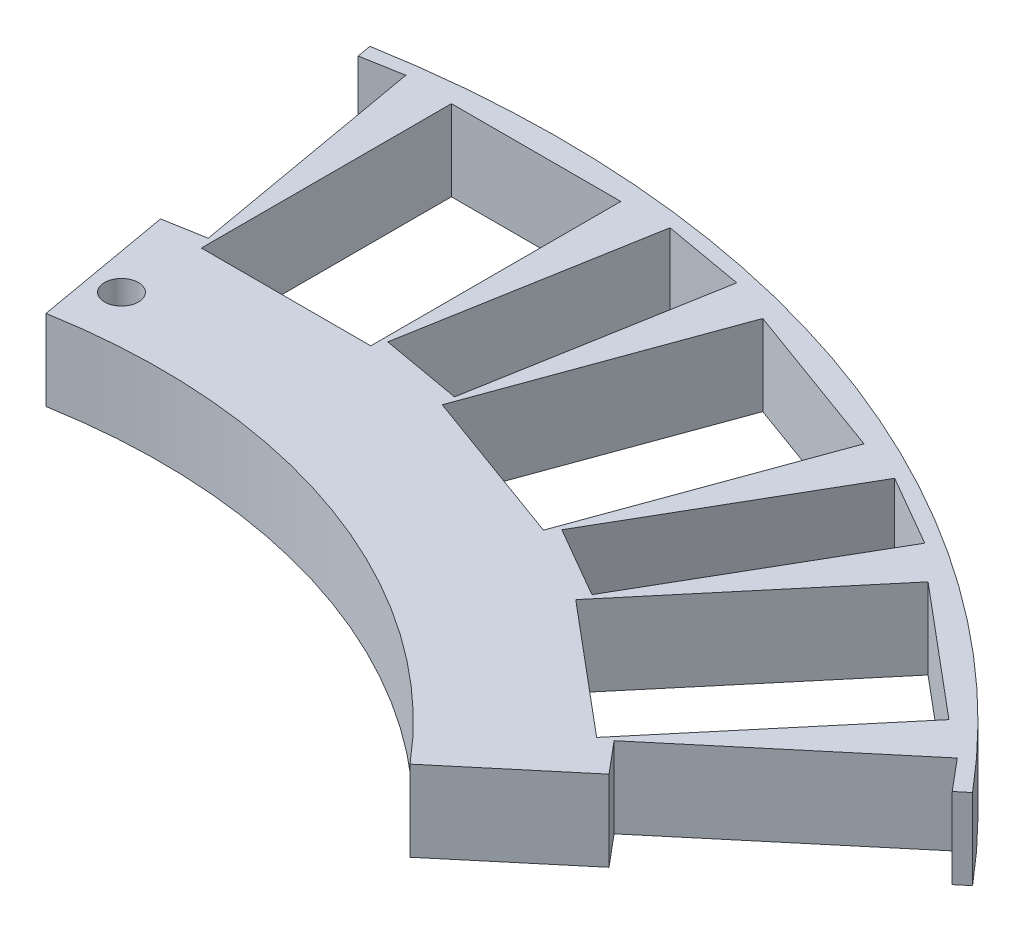
ISO-10303-21;
HEADER;
FILE_DESCRIPTION(('STEP AP214'),'2;1');
FILE_NAME('part.step','',(''),(''),'','','');
FILE_SCHEMA(('AUTOMOTIVE_DESIGN { 1 0 10303 214 1 1 1 1 }'));
ENDSEC;
DATA;
#1=APPLICATION_CONTEXT('core data for automotive mechanical design processes');
#2=APPLICATION_PROTOCOL_DEFINITION('international standard','automotive_design',2000,#1);
#3=PRODUCT_CONTEXT('',#1,'mechanical');
#4=PRODUCT('Part','Part','',(#3));
#5=PRODUCT_RELATED_PRODUCT_CATEGORY('part','',(#4));
#6=PRODUCT_DEFINITION_FORMATION('','',#4);
#7=PRODUCT_DEFINITION_CONTEXT('part definition',#1,'design');
#8=PRODUCT_DEFINITION('design','',#6,#7);
#9=PRODUCT_DEFINITION_SHAPE('','',#8);
#10=(LENGTH_UNIT() NAMED_UNIT(*) SI_UNIT(.MILLI.,.METRE.));
#11=(NAMED_UNIT(*) PLANE_ANGLE_UNIT() SI_UNIT($,.RADIAN.));
#12=(NAMED_UNIT(*) SI_UNIT($,.STERADIAN.) SOLID_ANGLE_UNIT());
#13=UNCERTAINTY_MEASURE_WITH_UNIT(LENGTH_MEASURE(1.E-05),#10,'distance_accuracy_value','');
#14=(GEOMETRIC_REPRESENTATION_CONTEXT(3) GLOBAL_UNCERTAINTY_ASSIGNED_CONTEXT((#13)) GLOBAL_UNIT_ASSIGNED_CONTEXT((#10,
#11,#12)) REPRESENTATION_CONTEXT('',''));
#15=CARTESIAN_POINT('',(0.,0.,0.));
#16=DIRECTION('',(0.,0.,1.));
#17=DIRECTION('',(1.,0.,0.));
#18=AXIS2_PLACEMENT_3D('',#15,#16,#17);
#19=CARTESIAN_POINT('',(0.,5.,0.));
#20=DIRECTION('',(0.,1.,0.));
#21=DIRECTION('',(0.,0.,1.));
#22=AXIS2_PLACEMENT_3D('',#19,#20,#21);
#23=PLANE('',#22);
#24=DIRECTION('',(-0.866025403784436,0.,-0.500000000000004));
#25=VECTOR('',#24,1.);
#26=CARTESIAN_POINT('',(57.1877759871549,5.,-109.252133581619));
#27=LINE('',#26,#25);
#28=CARTESIAN_POINT('',(66.0212351057561,5.,-104.152133581618));
#29=VERTEX_POINT('',#28);
#30=CARTESIAN_POINT('',(57.1877759871549,5.,-109.252133581619));
#31=VERTEX_POINT('',#30);
#32=EDGE_CURVE('E305',#29,#31,#27,.T.);
#33=ORIENTED_EDGE('',*,*,#32,.F.);
#34=DIRECTION('',(0.500000000000004,0.,-0.866025403784436));
#35=VECTOR('',#34,1.);
#36=CARTESIAN_POINT('',(50.921235105756,5.,-77.9981663873285));
#37=LINE('',#36,#35);
#38=CARTESIAN_POINT('',(50.921235105756,5.,-77.9981663873285));
#39=VERTEX_POINT('',#38);
#40=EDGE_CURVE('E303',#39,#29,#37,.T.);
#41=ORIENTED_EDGE('',*,*,#40,.F.);
#42=DIRECTION('',(0.866025403784436,0.,0.500000000000005));
#43=VECTOR('',#42,1.);
#44=CARTESIAN_POINT('',(42.0877759871548,5.,-83.0981663873286));
#45=LINE('',#44,#43);
#46=CARTESIAN_POINT('',(42.0877759871548,5.,-83.0981663873286));
#47=VERTEX_POINT('',#46);
#48=EDGE_CURVE('E311',#47,#39,#45,.T.);
#49=ORIENTED_EDGE('',*,*,#48,.F.);
#50=DIRECTION('',(-0.500000000000004,0.,0.866025403784436));
#51=VECTOR('',#50,1.);
#52=CARTESIAN_POINT('',(42.0877759871548,5.,-83.0981663873286));
#53=LINE('',#52,#51);
#54=EDGE_CURVE('E308',#31,#47,#53,.T.);
#55=ORIENTED_EDGE('',*,*,#54,.F.);
#56=EDGE_LOOP('',(#33,#41,#49,#55));
#57=FACE_BOUND('',#56,.T.);
#58=DIRECTION('',(-0.984807753012207,0.,-0.173648177666935));
#59=VECTOR('',#58,1.);
#60=CARTESIAN_POINT('',(16.3725007080666,5.,-122.222795071366));
#61=LINE('',#60,#59);
#62=CARTESIAN_POINT('',(26.4175397887911,5.,-120.451583659163));
#63=VERTEX_POINT('',#62);
#64=CARTESIAN_POINT('',(16.3725007080666,5.,-122.222795071366));
#65=VERTEX_POINT('',#64);
#66=EDGE_CURVE('E336',#63,#65,#61,.T.);
#67=ORIENTED_EDGE('',*,*,#66,.F.);
#68=DIRECTION('',(0.173648177666934,0.,-0.984807753012207));
#69=VECTOR('',#68,1.);
#70=CARTESIAN_POINT('',(21.1733648232497,5.,-90.7103895181948));
#71=LINE('',#70,#69);
#72=CARTESIAN_POINT('',(21.1733648232497,5.,-90.7103895181948));
#73=VERTEX_POINT('',#72);
#74=EDGE_CURVE('E334',#73,#63,#71,.T.);
#75=ORIENTED_EDGE('',*,*,#74,.F.);
#76=DIRECTION('',(0.984807753012207,0.,0.173648177666935));
#77=VECTOR('',#76,1.);
#78=CARTESIAN_POINT('',(11.1283257425252,5.,-92.4816009303976));
#79=LINE('',#78,#77);
#80=CARTESIAN_POINT('',(11.1283257425252,5.,-92.4816009303976));
#81=VERTEX_POINT('',#80);
#82=EDGE_CURVE('E342',#81,#73,#79,.T.);
#83=ORIENTED_EDGE('',*,*,#82,.F.);
#84=DIRECTION('',(-0.173648177666934,0.,0.984807753012207));
#85=VECTOR('',#84,1.);
#86=CARTESIAN_POINT('',(11.1283257425252,5.,-92.4816009303976));
#87=LINE('',#86,#85);
#88=EDGE_CURVE('E339',#65,#81,#87,.T.);
#89=ORIENTED_EDGE('',*,*,#88,.F.);
#90=EDGE_LOOP('',(#67,#75,#83,#89));
#91=FACE_BOUND('',#90,.T.);
#92=DIRECTION('',(0.642787609686539,0.,-0.766044443118978));
#93=VECTOR('',#92,1.);
#94=CARTESIAN_POINT('',(86.4635550345105,5.,-86.7081521588147));
#95=LINE('',#94,#93);
#96=CARTESIAN_POINT('',(66.5371391342278,5.,-62.9607744221263));
#97=VERTEX_POINT('',#96);
#98=CARTESIAN_POINT('',(86.4635550345105,5.,-86.7081521588147));
#99=VERTEX_POINT('',#98);
#100=EDGE_CURVE('E394',#97,#99,#95,.T.);
#101=ORIENTED_EDGE('',*,*,#100,.F.);
#102=DIRECTION('',(0.766044443118942,0.,0.642787609686582));
#103=VECTOR('',#102,1.);
#104=CARTESIAN_POINT('',(50.4502058287284,5.,-76.4593142255459));
#105=LINE('',#104,#103);
#106=CARTESIAN_POINT('',(50.4502058287284,5.,-76.4593142255459));
#107=VERTEX_POINT('',#106);
#108=EDGE_CURVE('E392',#107,#97,#105,.T.);
#109=ORIENTED_EDGE('',*,*,#108,.F.);
#110=DIRECTION('',(-0.642787609686539,0.,0.766044443118978));
#111=VECTOR('',#110,1.);
#112=CARTESIAN_POINT('',(70.3766217290111,5.,-100.206691962234));
#113=LINE('',#112,#111);
#114=CARTESIAN_POINT('',(70.3766217290111,5.,-100.206691962234));
#115=VERTEX_POINT('',#114);
#116=EDGE_CURVE('E400',#115,#107,#113,.T.);
#117=ORIENTED_EDGE('',*,*,#116,.F.);
#118=DIRECTION('',(-0.766044443118942,0.,-0.642787609686582));
#119=VECTOR('',#118,1.);
#120=CARTESIAN_POINT('',(70.3766217290111,5.,-100.206691962234));
#121=LINE('',#120,#119);
#122=EDGE_CURVE('E397',#99,#115,#121,.T.);
#123=ORIENTED_EDGE('',*,*,#122,.F.);
#124=EDGE_LOOP('',(#101,#109,#117,#123));
#125=FACE_BOUND('',#124,.T.);
#126=DIRECTION('',(0.342020143325691,0.,-0.939692620785901));
#127=VECTOR('',#126,1.);
#128=CARTESIAN_POINT('',(51.5932300039861,5.,-111.051288230968));
#129=LINE('',#128,#127);
#130=CARTESIAN_POINT('',(40.9906055608897,5.,-81.9208169866052));
#131=VERTEX_POINT('',#130);
#132=CARTESIAN_POINT('',(51.5932300039861,5.,-111.051288230968));
#133=VERTEX_POINT('',#132);
#134=EDGE_CURVE('E425',#131,#133,#129,.T.);
#135=ORIENTED_EDGE('',*,*,#134,.F.);
#136=DIRECTION('',(0.939692620785955,0.,0.342020143325541));
#137=VECTOR('',#136,1.);
#138=CARTESIAN_POINT('',(21.2570605243848,5.,-89.1032399964415));
#139=LINE('',#138,#137);
#140=CARTESIAN_POINT('',(21.2570605243848,5.,-89.1032399964415));
#141=VERTEX_POINT('',#140);
#142=EDGE_CURVE('E423',#141,#131,#139,.T.);
#143=ORIENTED_EDGE('',*,*,#142,.F.);
#144=DIRECTION('',(-0.342020143325669,0.,0.939692620785909));
#145=VECTOR('',#144,1.);
#146=CARTESIAN_POINT('',(31.8596849674805,5.,-118.233711240805));
#147=LINE('',#146,#145);
#148=CARTESIAN_POINT('',(31.8596849674805,5.,-118.233711240805));
#149=VERTEX_POINT('',#148);
#150=EDGE_CURVE('E431',#149,#141,#147,.T.);
#151=ORIENTED_EDGE('',*,*,#150,.F.);
#152=DIRECTION('',(-0.939692620785955,0.,-0.342020143325541));
#153=VECTOR('',#152,1.);
#154=CARTESIAN_POINT('',(31.8596849674805,5.,-118.233711240805));
#155=LINE('',#154,#153);
#156=EDGE_CURVE('E428',#133,#149,#155,.T.);
#157=ORIENTED_EDGE('',*,*,#156,.F.);
#158=EDGE_LOOP('',(#135,#143,#151,#157));
#159=FACE_BOUND('',#158,.T.);
#160=DIRECTION('',(-1.,0.,0.));
#161=VECTOR('',#160,1.);
#162=CARTESIAN_POINT('',(-10.5,5.,-122.));
#163=LINE('',#162,#161);
#164=CARTESIAN_POINT('',(10.5,5.,-122.));
#165=VERTEX_POINT('',#164);
#166=CARTESIAN_POINT('',(-10.5,5.,-122.));
#167=VERTEX_POINT('',#166);
#168=EDGE_CURVE('E456',#165,#167,#163,.T.);
#169=ORIENTED_EDGE('',*,*,#168,.F.);
#170=DIRECTION('',(0.,0.,-1.));
#171=VECTOR('',#170,1.);
#172=CARTESIAN_POINT('',(10.5,5.,-122.));
#173=LINE('',#172,#171);
#174=CARTESIAN_POINT('',(10.5,5.,-91.));
#175=VERTEX_POINT('',#174);
#176=EDGE_CURVE('E454',#175,#165,#173,.T.);
#177=ORIENTED_EDGE('',*,*,#176,.F.);
#178=DIRECTION('',(1.,0.,0.));
#179=VECTOR('',#178,1.);
#180=CARTESIAN_POINT('',(-10.5,5.,-91.));
#181=LINE('',#180,#179);
#182=CARTESIAN_POINT('',(-10.5,5.,-91.));
#183=VERTEX_POINT('',#182);
#184=EDGE_CURVE('E462',#183,#175,#181,.T.);
#185=ORIENTED_EDGE('',*,*,#184,.F.);
#186=DIRECTION('',(0.,0.,1.));
#187=VECTOR('',#186,1.);
#188=CARTESIAN_POINT('',(-10.5,5.,-122.));
#189=LINE('',#188,#187);
#190=EDGE_CURVE('E459',#167,#183,#189,.T.);
#191=ORIENTED_EDGE('',*,*,#190,.F.);
#192=EDGE_LOOP('',(#169,#177,#185,#191));
#193=FACE_BOUND('',#192,.T.);
#194=CARTESIAN_POINT('',(-10.7031477620443,5.,-81.2984786326524));
#195=DIRECTION('',(0.,1.,0.));
#196=DIRECTION('',(0.,0.,1.));
#197=AXIS2_PLACEMENT_3D('',#194,#195,#196);
#198=CIRCLE('',#197,2.1);
#199=CARTESIAN_POINT('',(-10.7031477620443,5.,-79.1984786326525));
#200=VERTEX_POINT('',#199);
#201=EDGE_CURVE('E386',#200,#200,#198,.T.);
#202=ORIENTED_EDGE('',*,*,#201,.F.);
#203=EDGE_LOOP('',(#202));
#204=FACE_BOUND('',#203,.T.);
#205=CARTESIAN_POINT('',(0.,5.,0.));
#206=DIRECTION('',(0.,1.,0.));
#207=DIRECTION('',(0.,0.,1.));
#208=AXIS2_PLACEMENT_3D('',#205,#206,#207);
#209=CIRCLE('',#208,75.5);
#210=CARTESIAN_POINT('',(57.8363554554831,5.,-48.5304645313334));
#211=VERTEX_POINT('',#210);
#212=CARTESIAN_POINT('',(-13.110437413853,5.,-74.3529853524217));
#213=VERTEX_POINT('',#212);
#214=EDGE_CURVE('E259',#211,#213,#209,.T.);
#215=ORIENTED_EDGE('',*,*,#214,.F.);
#216=DIRECTION('',(0.766044443118981,0.,-0.642787609686535));
#217=VECTOR('',#216,1.);
#218=CARTESIAN_POINT('',(94.3835782899086,5.,-79.1972257322535));
#219=LINE('',#218,#217);
#220=CARTESIAN_POINT('',(71.2490361077154,5.,-59.7850399197201));
#221=VERTEX_POINT('',#220);
#222=EDGE_CURVE('E241',#211,#221,#219,.T.);
#223=ORIENTED_EDGE('',*,*,#222,.T.);
#224=DIRECTION('',(0.642787609686535,0.,0.766044443118981));
#225=VECTOR('',#224,1.);
#226=CARTESIAN_POINT('',(67.9708192983141,5.,-63.6918665796269));
#227=LINE('',#226,#225);
#228=CARTESIAN_POINT('',(67.9708192983141,5.,-63.6918665796269));
#229=VERTEX_POINT('',#228);
#230=EDGE_CURVE('E283',#229,#221,#227,.T.);
#231=ORIENTED_EDGE('',*,*,#230,.F.);
#232=DIRECTION('',(-0.766044443118981,0.,0.642787609686536));
#233=VECTOR('',#232,1.);
#234=CARTESIAN_POINT('',(67.9708192983141,5.,-63.6918665796269));
#235=LINE('',#234,#233);
#236=CARTESIAN_POINT('',(91.1053614805073,5.,-83.1040523921603));
#237=VERTEX_POINT('',#236);
#238=EDGE_CURVE('E291',#237,#229,#235,.T.);
#239=ORIENTED_EDGE('',*,*,#238,.F.);
#240=DIRECTION('',(-0.642787609686535,0.,-0.766044443118981));
#241=VECTOR('',#240,1.);
#242=CARTESIAN_POINT('',(91.1053614805073,5.,-83.1040523921603));
#243=LINE('',#242,#241);
#244=CARTESIAN_POINT('',(94.3835782899086,5.,-79.1972257322535));
#245=VERTEX_POINT('',#244);
#246=EDGE_CURVE('E289',#245,#237,#243,.T.);
#247=ORIENTED_EDGE('',*,*,#246,.F.);
#248=CARTESIAN_POINT('',(95.7555553898727,5.,-80.3484512108169));
#249=VERTEX_POINT('',#248);
#250=EDGE_CURVE('E252',#245,#249,#219,.T.);
#251=ORIENTED_EDGE('',*,*,#250,.T.);
#252=CARTESIAN_POINT('',(0.,5.,0.));
#253=DIRECTION('',(0.,1.,0.));
#254=DIRECTION('',(0.,0.,1.));
#255=AXIS2_PLACEMENT_3D('',#252,#253,#254);
#256=CIRCLE('',#255,125.);
#257=CARTESIAN_POINT('',(-21.7060222083659,5.,-123.100969126526));
#258=VERTEX_POINT('',#257);
#259=EDGE_CURVE('E269',#249,#258,#256,.T.);
#260=ORIENTED_EDGE('',*,*,#259,.T.);
#261=DIRECTION('',(0.173648177666928,0.,0.984807753012209));
#262=VECTOR('',#261,1.);
#263=CARTESIAN_POINT('',(-10.697510124214,5.,-60.6685946826325));
#264=LINE('',#263,#262);
#265=CARTESIAN_POINT('',(-21.3950202484281,5.,-121.337189365265));
#266=VERTEX_POINT('',#265);
#267=EDGE_CURVE('E866',#258,#266,#264,.T.);
#268=ORIENTED_EDGE('',*,*,#267,.T.);
#269=DIRECTION('',(-0.984807753012209,0.,0.173648177666927));
#270=VECTOR('',#269,1.);
#271=CARTESIAN_POINT('',(-26.4175397887903,5.,-120.451583659164));
#272=LINE('',#271,#270);
#273=CARTESIAN_POINT('',(-16.3725007080658,5.,-122.222795071366));
#274=VERTEX_POINT('',#273);
#275=EDGE_CURVE('E367',#274,#266,#272,.T.);
#276=ORIENTED_EDGE('',*,*,#275,.F.);
#277=DIRECTION('',(-0.173648177666927,0.,-0.984807753012209));
#278=VECTOR('',#277,1.);
#279=CARTESIAN_POINT('',(-11.1283257425246,5.,-92.4816009303976));
#280=LINE('',#279,#278);
#281=CARTESIAN_POINT('',(-11.1283257425246,5.,-92.4816009303976));
#282=VERTEX_POINT('',#281);
#283=EDGE_CURVE('E365',#282,#274,#280,.T.);
#284=ORIENTED_EDGE('',*,*,#283,.F.);
#285=DIRECTION('',(0.984807753012209,0.,-0.173648177666927));
#286=VECTOR('',#285,1.);
#287=CARTESIAN_POINT('',(-21.1733648232491,5.,-90.710389518195));
#288=LINE('',#287,#286);
#289=CARTESIAN_POINT('',(-16.1508452828869,5.,-91.5959952242963));
#290=VERTEX_POINT('',#289);
#291=EDGE_CURVE('E371',#290,#282,#288,.T.);
#292=ORIENTED_EDGE('',*,*,#291,.F.);
#293=EDGE_CURVE('E57',#290,#213,#264,.T.);
#294=ORIENTED_EDGE('',*,*,#293,.T.);
#295=EDGE_LOOP('',(#215,#223,#231,#239,#247,#251,#260,#268,#276,#284,#292,#294));
#296=FACE_BOUND('',#295,.T.);
#297=ADVANCED_FACE('F34',(#57,#91,#125,#159,#193,#204,#296),#23,.T.);
#298=CARTESIAN_POINT('',(0.,-5.,0.));
#299=DIRECTION('',(0.,1.,0.));
#300=DIRECTION('',(0.,0.,1.));
#301=AXIS2_PLACEMENT_3D('',#298,#299,#300);
#302=PLANE('',#301);
#303=DIRECTION('',(0.173648177666934,0.,-0.984807753012207));
#304=VECTOR('',#303,1.);
#305=CARTESIAN_POINT('',(21.1733648232497,-5.,-90.7103895181948));
#306=LINE('',#305,#304);
#307=CARTESIAN_POINT('',(21.1733648232497,-5.,-90.7103895181948));
#308=VERTEX_POINT('',#307);
#309=CARTESIAN_POINT('',(26.4175397887911,-5.,-120.451583659163));
#310=VERTEX_POINT('',#309);
#311=EDGE_CURVE('E333',#308,#310,#306,.T.);
#312=ORIENTED_EDGE('',*,*,#311,.T.);
#313=DIRECTION('',(-0.984807753012207,0.,-0.173648177666935));
#314=VECTOR('',#313,1.);
#315=CARTESIAN_POINT('',(16.3725007080666,-5.,-122.222795071366));
#316=LINE('',#315,#314);
#317=CARTESIAN_POINT('',(16.3725007080666,-5.,-122.222795071366));
#318=VERTEX_POINT('',#317);
#319=EDGE_CURVE('E347',#310,#318,#316,.T.);
#320=ORIENTED_EDGE('',*,*,#319,.T.);
#321=DIRECTION('',(-0.173648177666934,0.,0.984807753012207));
#322=VECTOR('',#321,1.);
#323=CARTESIAN_POINT('',(11.1283257425252,-5.,-92.4816009303976));
#324=LINE('',#323,#322);
#325=CARTESIAN_POINT('',(11.1283257425252,-5.,-92.4816009303976));
#326=VERTEX_POINT('',#325);
#327=EDGE_CURVE('E350',#318,#326,#324,.T.);
#328=ORIENTED_EDGE('',*,*,#327,.T.);
#329=DIRECTION('',(0.984807753012207,0.,0.173648177666935));
#330=VECTOR('',#329,1.);
#331=CARTESIAN_POINT('',(11.1283257425252,-5.,-92.4816009303976));
#332=LINE('',#331,#330);
#333=EDGE_CURVE('E337',#326,#308,#332,.T.);
#334=ORIENTED_EDGE('',*,*,#333,.T.);
#335=EDGE_LOOP('',(#312,#320,#328,#334));
#336=FACE_BOUND('',#335,.T.);
#337=CARTESIAN_POINT('',(-10.7031477620443,-5.,-81.2984786326524));
#338=DIRECTION('',(0.,1.,0.));
#339=DIRECTION('',(0.,0.,1.));
#340=AXIS2_PLACEMENT_3D('',#337,#338,#339);
#341=CIRCLE('',#340,2.1);
#342=CARTESIAN_POINT('',(-10.7031477620443,-5.,-79.1984786326525));
#343=VERTEX_POINT('',#342);
#344=EDGE_CURVE('E385',#343,#343,#341,.T.);
#345=ORIENTED_EDGE('',*,*,#344,.T.);
#346=EDGE_LOOP('',(#345));
#347=FACE_BOUND('',#346,.T.);
#348=DIRECTION('',(0.939692620785955,0.,0.342020143325541));
#349=VECTOR('',#348,1.);
#350=CARTESIAN_POINT('',(21.2570605243848,-5.,-89.1032399964415));
#351=LINE('',#350,#349);
#352=CARTESIAN_POINT('',(21.2570605243848,-5.,-89.1032399964415));
#353=VERTEX_POINT('',#352);
#354=CARTESIAN_POINT('',(40.9906055608897,-5.,-81.9208169866052));
#355=VERTEX_POINT('',#354);
#356=EDGE_CURVE('E422',#353,#355,#351,.T.);
#357=ORIENTED_EDGE('',*,*,#356,.T.);
#358=DIRECTION('',(0.342020143325691,0.,-0.939692620785901));
#359=VECTOR('',#358,1.);
#360=CARTESIAN_POINT('',(51.5932300039861,-5.,-111.051288230968));
#361=LINE('',#360,#359);
#362=CARTESIAN_POINT('',(51.5932300039861,-5.,-111.051288230968));
#363=VERTEX_POINT('',#362);
#364=EDGE_CURVE('E436',#355,#363,#361,.T.);
#365=ORIENTED_EDGE('',*,*,#364,.T.);
#366=DIRECTION('',(-0.939692620785955,0.,-0.342020143325541));
#367=VECTOR('',#366,1.);
#368=CARTESIAN_POINT('',(31.8596849674805,-5.,-118.233711240805));
#369=LINE('',#368,#367);
#370=CARTESIAN_POINT('',(31.8596849674805,-5.,-118.233711240805));
#371=VERTEX_POINT('',#370);
#372=EDGE_CURVE('E439',#363,#371,#369,.T.);
#373=ORIENTED_EDGE('',*,*,#372,.T.);
#374=DIRECTION('',(-0.342020143325669,0.,0.939692620785909));
#375=VECTOR('',#374,1.);
#376=CARTESIAN_POINT('',(31.8596849674805,-5.,-118.233711240805));
#377=LINE('',#376,#375);
#378=EDGE_CURVE('E426',#371,#353,#377,.T.);
#379=ORIENTED_EDGE('',*,*,#378,.T.);
#380=EDGE_LOOP('',(#357,#365,#373,#379));
#381=FACE_BOUND('',#380,.T.);
#382=DIRECTION('',(0.,0.,-1.));
#383=VECTOR('',#382,1.);
#384=CARTESIAN_POINT('',(10.5,-5.,-122.));
#385=LINE('',#384,#383);
#386=CARTESIAN_POINT('',(10.5,-5.,-91.));
#387=VERTEX_POINT('',#386);
#388=CARTESIAN_POINT('',(10.5,-5.,-122.));
#389=VERTEX_POINT('',#388);
#390=EDGE_CURVE('E453',#387,#389,#385,.T.);
#391=ORIENTED_EDGE('',*,*,#390,.T.);
#392=DIRECTION('',(-1.,0.,0.));
#393=VECTOR('',#392,1.);
#394=CARTESIAN_POINT('',(-10.5,-5.,-122.));
#395=LINE('',#394,#393);
#396=CARTESIAN_POINT('',(-10.5,-5.,-122.));
#397=VERTEX_POINT('',#396);
#398=EDGE_CURVE('E467',#389,#397,#395,.T.);
#399=ORIENTED_EDGE('',*,*,#398,.T.);
#400=DIRECTION('',(0.,0.,1.));
#401=VECTOR('',#400,1.);
#402=CARTESIAN_POINT('',(-10.5,-5.,-122.));
#403=LINE('',#402,#401);
#404=CARTESIAN_POINT('',(-10.5,-5.,-91.));
#405=VERTEX_POINT('',#404);
#406=EDGE_CURVE('E470',#397,#405,#403,.T.);
#407=ORIENTED_EDGE('',*,*,#406,.T.);
#408=DIRECTION('',(1.,0.,0.));
#409=VECTOR('',#408,1.);
#410=CARTESIAN_POINT('',(-10.5,-5.,-91.));
#411=LINE('',#410,#409);
#412=EDGE_CURVE('E457',#405,#387,#411,.T.);
#413=ORIENTED_EDGE('',*,*,#412,.T.);
#414=EDGE_LOOP('',(#391,#399,#407,#413));
#415=FACE_BOUND('',#414,.T.);
#416=DIRECTION('',(0.766044443118942,0.,0.642787609686582));
#417=VECTOR('',#416,1.);
#418=CARTESIAN_POINT('',(50.4502058287284,-5.,-76.4593142255459));
#419=LINE('',#418,#417);
#420=CARTESIAN_POINT('',(50.4502058287284,-5.,-76.4593142255459));
#421=VERTEX_POINT('',#420);
#422=CARTESIAN_POINT('',(66.5371391342278,-5.,-62.9607744221263));
#423=VERTEX_POINT('',#422);
#424=EDGE_CURVE('E389',#421,#423,#419,.T.);
#425=ORIENTED_EDGE('',*,*,#424,.T.);
#426=DIRECTION('',(0.642787609686539,0.,-0.766044443118978));
#427=VECTOR('',#426,1.);
#428=CARTESIAN_POINT('',(86.4635550345105,-5.,-86.7081521588147));
#429=LINE('',#428,#427);
#430=CARTESIAN_POINT('',(86.4635550345105,-5.,-86.7081521588147));
#431=VERTEX_POINT('',#430);
#432=EDGE_CURVE('E405',#423,#431,#429,.T.);
#433=ORIENTED_EDGE('',*,*,#432,.T.);
#434=DIRECTION('',(-0.766044443118942,0.,-0.642787609686582));
#435=VECTOR('',#434,1.);
#436=CARTESIAN_POINT('',(70.3766217290111,-5.,-100.206691962234));
#437=LINE('',#436,#435);
#438=CARTESIAN_POINT('',(70.3766217290111,-5.,-100.206691962234));
#439=VERTEX_POINT('',#438);
#440=EDGE_CURVE('E408',#431,#439,#437,.T.);
#441=ORIENTED_EDGE('',*,*,#440,.T.);
#442=DIRECTION('',(-0.642787609686539,0.,0.766044443118978));
#443=VECTOR('',#442,1.);
#444=CARTESIAN_POINT('',(70.3766217290111,-5.,-100.206691962234));
#445=LINE('',#444,#443);
#446=EDGE_CURVE('E395',#439,#421,#445,.T.);
#447=ORIENTED_EDGE('',*,*,#446,.T.);
#448=EDGE_LOOP('',(#425,#433,#441,#447));
#449=FACE_BOUND('',#448,.T.);
#450=DIRECTION('',(0.500000000000004,0.,-0.866025403784436));
#451=VECTOR('',#450,1.);
#452=CARTESIAN_POINT('',(50.921235105756,-5.,-77.9981663873285));
#453=LINE('',#452,#451);
#454=CARTESIAN_POINT('',(50.921235105756,-5.,-77.9981663873285));
#455=VERTEX_POINT('',#454);
#456=CARTESIAN_POINT('',(66.0212351057561,-5.,-104.152133581618));
#457=VERTEX_POINT('',#456);
#458=EDGE_CURVE('E302',#455,#457,#453,.T.);
#459=ORIENTED_EDGE('',*,*,#458,.T.);
#460=DIRECTION('',(-0.866025403784436,0.,-0.500000000000004));
#461=VECTOR('',#460,1.);
#462=CARTESIAN_POINT('',(57.1877759871549,-5.,-109.252133581619));
#463=LINE('',#462,#461);
#464=CARTESIAN_POINT('',(57.1877759871549,-5.,-109.252133581619));
#465=VERTEX_POINT('',#464);
#466=EDGE_CURVE('E316',#457,#465,#463,.T.);
#467=ORIENTED_EDGE('',*,*,#466,.T.);
#468=DIRECTION('',(-0.500000000000004,0.,0.866025403784436));
#469=VECTOR('',#468,1.);
#470=CARTESIAN_POINT('',(42.0877759871548,-5.,-83.0981663873286));
#471=LINE('',#470,#469);
#472=CARTESIAN_POINT('',(42.0877759871548,-5.,-83.0981663873286));
#473=VERTEX_POINT('',#472);
#474=EDGE_CURVE('E319',#465,#473,#471,.T.);
#475=ORIENTED_EDGE('',*,*,#474,.T.);
#476=DIRECTION('',(0.866025403784436,0.,0.500000000000005));
#477=VECTOR('',#476,1.);
#478=CARTESIAN_POINT('',(42.0877759871548,-5.,-83.0981663873286));
#479=LINE('',#478,#477);
#480=EDGE_CURVE('E306',#473,#455,#479,.T.);
#481=ORIENTED_EDGE('',*,*,#480,.T.);
#482=EDGE_LOOP('',(#459,#467,#475,#481));
#483=FACE_BOUND('',#482,.T.);
#484=DIRECTION('',(0.766044443118981,0.,-0.642787609686536));
#485=VECTOR('',#484,1.);
#486=CARTESIAN_POINT('',(51.3077536205209,-5.,-43.0523171395134));
#487=LINE('',#486,#485);
#488=CARTESIAN_POINT('',(57.8363554554831,-5.,-48.5304645313334));
#489=VERTEX_POINT('',#488);
#490=CARTESIAN_POINT('',(71.2490361077154,-5.,-59.7850399197201));
#491=VERTEX_POINT('',#490);
#492=EDGE_CURVE('E286',#489,#491,#487,.T.);
#493=ORIENTED_EDGE('',*,*,#492,.F.);
#494=CARTESIAN_POINT('',(0.,-5.,0.));
#495=DIRECTION('',(0.,1.,0.));
#496=DIRECTION('',(0.,0.,1.));
#497=AXIS2_PLACEMENT_3D('',#494,#495,#496);
#498=CIRCLE('',#497,75.5);
#499=CARTESIAN_POINT('',(-13.110437413853,-5.,-74.3529853524217));
#500=VERTEX_POINT('',#499);
#501=EDGE_CURVE('E261',#489,#500,#498,.T.);
#502=ORIENTED_EDGE('',*,*,#501,.T.);
#503=DIRECTION('',(0.173648177666927,0.,0.984807753012209));
#504=VECTOR('',#503,1.);
#505=CARTESIAN_POINT('',(-21.3950202484281,-5.,-121.337189365265));
#506=LINE('',#505,#504);
#507=CARTESIAN_POINT('',(-16.1508452828869,-5.,-91.5959952242963));
#508=VERTEX_POINT('',#507);
#509=EDGE_CURVE('E251',#508,#500,#506,.T.);
#510=ORIENTED_EDGE('',*,*,#509,.F.);
#511=DIRECTION('',(0.984807753012209,0.,-0.173648177666927));
#512=VECTOR('',#511,1.);
#513=CARTESIAN_POINT('',(-21.1733648232491,-5.,-90.710389518195));
#514=LINE('',#513,#512);
#515=CARTESIAN_POINT('',(-11.1283257425246,-5.,-92.4816009303976));
#516=VERTEX_POINT('',#515);
#517=EDGE_CURVE('E368',#508,#516,#514,.T.);
#518=ORIENTED_EDGE('',*,*,#517,.T.);
#519=DIRECTION('',(-0.173648177666927,0.,-0.984807753012209));
#520=VECTOR('',#519,1.);
#521=CARTESIAN_POINT('',(-11.1283257425246,-5.,-92.4816009303976));
#522=LINE('',#521,#520);
#523=CARTESIAN_POINT('',(-16.3725007080658,-5.,-122.222795071366));
#524=VERTEX_POINT('',#523);
#525=EDGE_CURVE('E364',#516,#524,#522,.T.);
#526=ORIENTED_EDGE('',*,*,#525,.T.);
#527=DIRECTION('',(-0.984807753012209,0.,0.173648177666927));
#528=VECTOR('',#527,1.);
#529=CARTESIAN_POINT('',(-26.4175397887903,-5.,-120.451583659164));
#530=LINE('',#529,#528);
#531=CARTESIAN_POINT('',(-21.3950202484281,-5.,-121.337189365265));
#532=VERTEX_POINT('',#531);
#533=EDGE_CURVE('E376',#524,#532,#530,.T.);
#534=ORIENTED_EDGE('',*,*,#533,.T.);
#535=CARTESIAN_POINT('',(-21.7060222083659,-5.,-123.100969126526));
#536=VERTEX_POINT('',#535);
#537=EDGE_CURVE('E49',#536,#532,#506,.T.);
#538=ORIENTED_EDGE('',*,*,#537,.F.);
#539=CARTESIAN_POINT('',(0.,-5.,0.));
#540=DIRECTION('',(0.,1.,0.));
#541=DIRECTION('',(0.,0.,1.));
#542=AXIS2_PLACEMENT_3D('',#539,#540,#541);
#543=CIRCLE('',#542,125.);
#544=CARTESIAN_POINT('',(95.7555553898727,-5.,-80.348451210817));
#545=VERTEX_POINT('',#544);
#546=EDGE_CURVE('E266',#545,#536,#543,.T.);
#547=ORIENTED_EDGE('',*,*,#546,.F.);
#548=CARTESIAN_POINT('',(94.3835782899086,-5.,-79.1972257322535));
#549=VERTEX_POINT('',#548);
#550=EDGE_CURVE('E861',#549,#545,#487,.T.);
#551=ORIENTED_EDGE('',*,*,#550,.F.);
#552=DIRECTION('',(-0.642787609686535,0.,-0.766044443118981));
#553=VECTOR('',#552,1.);
#554=CARTESIAN_POINT('',(91.1053614805073,-5.,-83.1040523921603));
#555=LINE('',#554,#553);
#556=CARTESIAN_POINT('',(91.1053614805073,-5.,-83.1040523921603));
#557=VERTEX_POINT('',#556);
#558=EDGE_CURVE('E293',#549,#557,#555,.T.);
#559=ORIENTED_EDGE('',*,*,#558,.T.);
#560=DIRECTION('',(-0.766044443118981,0.,0.642787609686536));
#561=VECTOR('',#560,1.);
#562=CARTESIAN_POINT('',(67.9708192983141,-5.,-63.6918665796269));
#563=LINE('',#562,#561);
#564=CARTESIAN_POINT('',(67.9708192983141,-5.,-63.6918665796269));
#565=VERTEX_POINT('',#564);
#566=EDGE_CURVE('E288',#557,#565,#563,.T.);
#567=ORIENTED_EDGE('',*,*,#566,.T.);
#568=DIRECTION('',(0.642787609686535,0.,0.766044443118981));
#569=VECTOR('',#568,1.);
#570=CARTESIAN_POINT('',(67.9708192983141,-5.,-63.6918665796269));
#571=LINE('',#570,#569);
#572=EDGE_CURVE('E281',#565,#491,#571,.T.);
#573=ORIENTED_EDGE('',*,*,#572,.T.);
#574=EDGE_LOOP('',(#493,#502,#510,#518,#526,#534,#538,#547,#551,#559,#567,#573));
#575=FACE_BOUND('',#574,.T.);
#576=ADVANCED_FACE('F285',(#336,#347,#381,#415,#449,#483,#575),#302,.F.);
#577=CARTESIAN_POINT('',(0.,5.,0.));
#578=DIRECTION('',(0.,-1.,0.));
#579=DIRECTION('',(0.,0.,-1.));
#580=AXIS2_PLACEMENT_3D('',#577,#578,#579);
#581=CYLINDRICAL_SURFACE('',#580,125.);
#582=DIRECTION('',(0.,-1.,0.));
#583=VECTOR('',#582,1.);
#584=CARTESIAN_POINT('',(95.7555553898727,5.,-80.3484512108169));
#585=LINE('',#584,#583);
#586=EDGE_CURVE('E262',#545,#249,#585,.F.);
#587=ORIENTED_EDGE('',*,*,#586,.F.);
#588=ORIENTED_EDGE('',*,*,#546,.T.);
#589=DIRECTION('',(0.,-1.,0.));
#590=VECTOR('',#589,1.);
#591=CARTESIAN_POINT('',(-21.7060222083659,5.,-123.100969126526));
#592=LINE('',#591,#590);
#593=EDGE_CURVE('E873',#258,#536,#592,.T.);
#594=ORIENTED_EDGE('',*,*,#593,.F.);
#595=ORIENTED_EDGE('',*,*,#259,.F.);
#596=EDGE_LOOP('',(#587,#588,#594,#595));
#597=FACE_BOUND('',#596,.T.);
#598=ADVANCED_FACE('F36',(#597),#581,.T.);
#599=CARTESIAN_POINT('',(0.,5.,0.));
#600=DIRECTION('',(0.,-1.,0.));
#601=DIRECTION('',(0.,0.,-1.));
#602=AXIS2_PLACEMENT_3D('',#599,#600,#601);
#603=CYLINDRICAL_SURFACE('',#602,75.5);
#604=ORIENTED_EDGE('',*,*,#501,.F.);
#605=DIRECTION('',(0.,-1.,0.));
#606=VECTOR('',#605,1.);
#607=CARTESIAN_POINT('',(57.8363554554831,5.,-48.5304645313334));
#608=LINE('',#607,#606);
#609=EDGE_CURVE('E244',#489,#211,#608,.F.);
#610=ORIENTED_EDGE('',*,*,#609,.T.);
#611=ORIENTED_EDGE('',*,*,#214,.T.);
#612=DIRECTION('',(0.,-1.,0.));
#613=VECTOR('',#612,1.);
#614=CARTESIAN_POINT('',(-13.110437413853,5.,-74.3529853524217));
#615=LINE('',#614,#613);
#616=EDGE_CURVE('E871',#213,#500,#615,.T.);
#617=ORIENTED_EDGE('',*,*,#616,.T.);
#618=EDGE_LOOP('',(#604,#610,#611,#617));
#619=FACE_BOUND('',#618,.T.);
#620=ADVANCED_FACE('F257',(#619),#603,.F.);
#621=CARTESIAN_POINT('',(-26.4175397887903,5.,-120.451583659164));
#622=DIRECTION('',(0.173648177666927,0.,0.984807753012209));
#623=DIRECTION('',(0.984807753012209,0.,-0.173648177666927));
#624=AXIS2_PLACEMENT_3D('',#621,#622,#623);
#625=PLANE('',#624);
#626=ORIENTED_EDGE('',*,*,#275,.T.);
#627=DIRECTION('',(0.,-1.,0.));
#628=VECTOR('',#627,1.);
#629=CARTESIAN_POINT('',(-21.3950202484281,5.,-121.337189365265));
#630=LINE('',#629,#628);
#631=EDGE_CURVE('E858',#266,#532,#630,.T.);
#632=ORIENTED_EDGE('',*,*,#631,.T.);
#633=ORIENTED_EDGE('',*,*,#533,.F.);
#634=DIRECTION('',(0.,-1.,0.));
#635=VECTOR('',#634,1.);
#636=CARTESIAN_POINT('',(-16.3725007080658,5.,-122.222795071366));
#637=LINE('',#636,#635);
#638=EDGE_CURVE('E382',#274,#524,#637,.T.);
#639=ORIENTED_EDGE('',*,*,#638,.F.);
#640=EDGE_LOOP('',(#626,#632,#633,#639));
#641=FACE_BOUND('',#640,.T.);
#642=ADVANCED_FACE('F522',(#641),#625,.T.);
#643=CARTESIAN_POINT('',(-21.1733648232491,5.,-90.710389518195));
#644=DIRECTION('',(-0.173648177666927,0.,-0.984807753012209));
#645=DIRECTION('',(-0.984807753012209,0.,0.173648177666927));
#646=AXIS2_PLACEMENT_3D('',#643,#644,#645);
#647=PLANE('',#646);
#648=ORIENTED_EDGE('',*,*,#517,.F.);
#649=DIRECTION('',(0.,1.,0.));
#650=VECTOR('',#649,1.);
#651=CARTESIAN_POINT('',(-16.1508452828869,5.,-91.5959952242963));
#652=LINE('',#651,#650);
#653=EDGE_CURVE('E12',#508,#290,#652,.T.);
#654=ORIENTED_EDGE('',*,*,#653,.T.);
#655=ORIENTED_EDGE('',*,*,#291,.T.);
#656=DIRECTION('',(0.,-1.,0.));
#657=VECTOR('',#656,1.);
#658=CARTESIAN_POINT('',(-11.1283257425246,5.,-92.4816009303976));
#659=LINE('',#658,#657);
#660=EDGE_CURVE('E373',#282,#516,#659,.T.);
#661=ORIENTED_EDGE('',*,*,#660,.T.);
#662=EDGE_LOOP('',(#648,#654,#655,#661));
#663=FACE_BOUND('',#662,.T.);
#664=ADVANCED_FACE('F532',(#663),#647,.T.);
#665=CARTESIAN_POINT('',(91.1053614805073,5.,-83.1040523921603));
#666=DIRECTION('',(-0.766044443118981,0.,0.642787609686535));
#667=DIRECTION('',(0.642787609686535,0.,0.766044443118981));
#668=AXIS2_PLACEMENT_3D('',#665,#666,#667);
#669=PLANE('',#668);
#670=ORIENTED_EDGE('',*,*,#558,.F.);
#671=DIRECTION('',(0.,1.,0.));
#672=VECTOR('',#671,1.);
#673=CARTESIAN_POINT('',(94.3835782899086,5.,-79.1972257322535));
#674=LINE('',#673,#672);
#675=EDGE_CURVE('E263',#549,#245,#674,.T.);
#676=ORIENTED_EDGE('',*,*,#675,.T.);
#677=ORIENTED_EDGE('',*,*,#246,.T.);
#678=DIRECTION('',(0.,-1.,0.));
#679=VECTOR('',#678,1.);
#680=CARTESIAN_POINT('',(91.1053614805073,5.,-83.1040523921603));
#681=LINE('',#680,#679);
#682=EDGE_CURVE('E299',#237,#557,#681,.T.);
#683=ORIENTED_EDGE('',*,*,#682,.T.);
#684=EDGE_LOOP('',(#670,#676,#677,#683));
#685=FACE_BOUND('',#684,.T.);
#686=ADVANCED_FACE('F527',(#685),#669,.T.);
#687=CARTESIAN_POINT('',(67.9708192983141,5.,-63.6918665796269));
#688=DIRECTION('',(0.766044443118981,0.,-0.642787609686535));
#689=DIRECTION('',(-0.642787609686535,0.,-0.766044443118981));
#690=AXIS2_PLACEMENT_3D('',#687,#688,#689);
#691=PLANE('',#690);
#692=ORIENTED_EDGE('',*,*,#230,.T.);
#693=DIRECTION('',(0.,-1.,0.));
#694=VECTOR('',#693,1.);
#695=CARTESIAN_POINT('',(71.2490361077154,5.,-59.7850399197201));
#696=LINE('',#695,#694);
#697=EDGE_CURVE('E42',#221,#491,#696,.T.);
#698=ORIENTED_EDGE('',*,*,#697,.T.);
#699=ORIENTED_EDGE('',*,*,#572,.F.);
#700=DIRECTION('',(0.,-1.,0.));
#701=VECTOR('',#700,1.);
#702=CARTESIAN_POINT('',(67.9708192983141,5.,-63.6918665796269));
#703=LINE('',#702,#701);
#704=EDGE_CURVE('E297',#229,#565,#703,.T.);
#705=ORIENTED_EDGE('',*,*,#704,.F.);
#706=EDGE_LOOP('',(#692,#698,#699,#705));
#707=FACE_BOUND('',#706,.T.);
#708=ADVANCED_FACE('F280',(#707),#691,.T.);
#709=CARTESIAN_POINT('',(10.5,5.,-122.));
#710=DIRECTION('',(-1.,0.,0.));
#711=DIRECTION('',(0.,0.,1.));
#712=AXIS2_PLACEMENT_3D('',#709,#710,#711);
#713=PLANE('',#712);
#714=ORIENTED_EDGE('',*,*,#390,.F.);
#715=DIRECTION('',(0.,-1.,0.));
#716=VECTOR('',#715,1.);
#717=CARTESIAN_POINT('',(10.5,5.,-91.));
#718=LINE('',#717,#716);
#719=EDGE_CURVE('E464',#175,#387,#718,.T.);
#720=ORIENTED_EDGE('',*,*,#719,.F.);
#721=ORIENTED_EDGE('',*,*,#176,.T.);
#722=DIRECTION('',(0.,-1.,0.));
#723=VECTOR('',#722,1.);
#724=CARTESIAN_POINT('',(10.5,5.,-122.));
#725=LINE('',#724,#723);
#726=EDGE_CURVE('E271',#165,#389,#725,.T.);
#727=ORIENTED_EDGE('',*,*,#726,.T.);
#728=EDGE_LOOP('',(#714,#720,#721,#727));
#729=FACE_BOUND('',#728,.T.);
#730=ADVANCED_FACE('F485',(#729),#713,.T.);
#731=CARTESIAN_POINT('',(-10.5,5.,-122.));
#732=DIRECTION('',(0.,0.,1.));
#733=DIRECTION('',(1.,0.,0.));
#734=AXIS2_PLACEMENT_3D('',#731,#732,#733);
#735=PLANE('',#734);
#736=ORIENTED_EDGE('',*,*,#398,.F.);
#737=ORIENTED_EDGE('',*,*,#726,.F.);
#738=ORIENTED_EDGE('',*,*,#168,.T.);
#739=DIRECTION('',(0.,-1.,0.));
#740=VECTOR('',#739,1.);
#741=CARTESIAN_POINT('',(-10.5,5.,-122.));
#742=LINE('',#741,#740);
#743=EDGE_CURVE('E478',#167,#397,#742,.T.);
#744=ORIENTED_EDGE('',*,*,#743,.T.);
#745=EDGE_LOOP('',(#736,#737,#738,#744));
#746=FACE_BOUND('',#745,.T.);
#747=ADVANCED_FACE('F498',(#746),#735,.T.);
#748=CARTESIAN_POINT('',(-10.5,5.,-122.));
#749=DIRECTION('',(1.,0.,0.));
#750=DIRECTION('',(0.,0.,-1.));
#751=AXIS2_PLACEMENT_3D('',#748,#749,#750);
#752=PLANE('',#751);
#753=ORIENTED_EDGE('',*,*,#406,.F.);
#754=ORIENTED_EDGE('',*,*,#743,.F.);
#755=ORIENTED_EDGE('',*,*,#190,.T.);
#756=DIRECTION('',(0.,-1.,0.));
#757=VECTOR('',#756,1.);
#758=CARTESIAN_POINT('',(-10.5,5.,-91.));
#759=LINE('',#758,#757);
#760=EDGE_CURVE('E477',#183,#405,#759,.T.);
#761=ORIENTED_EDGE('',*,*,#760,.T.);
#762=EDGE_LOOP('',(#753,#754,#755,#761));
#763=FACE_BOUND('',#762,.T.);
#764=ADVANCED_FACE('F500',(#763),#752,.T.);
#765=CARTESIAN_POINT('',(-10.5,5.,-91.));
#766=DIRECTION('',(0.,0.,-1.));
#767=DIRECTION('',(-1.,0.,0.));
#768=AXIS2_PLACEMENT_3D('',#765,#766,#767);
#769=PLANE('',#768);
#770=ORIENTED_EDGE('',*,*,#412,.F.);
#771=ORIENTED_EDGE('',*,*,#760,.F.);
#772=ORIENTED_EDGE('',*,*,#184,.T.);
#773=ORIENTED_EDGE('',*,*,#719,.T.);
#774=EDGE_LOOP('',(#770,#771,#772,#773));
#775=FACE_BOUND('',#774,.T.);
#776=ADVANCED_FACE('F493',(#775),#769,.T.);
#777=CARTESIAN_POINT('',(21.2570605243848,5.,-89.1032399964415));
#778=DIRECTION('',(0.342020143325541,0.,-0.939692620785955));
#779=DIRECTION('',(-0.939692620785955,0.,-0.342020143325541));
#780=AXIS2_PLACEMENT_3D('',#777,#778,#779);
#781=PLANE('',#780);
#782=ORIENTED_EDGE('',*,*,#356,.F.);
#783=DIRECTION('',(0.,-1.,0.));
#784=VECTOR('',#783,1.);
#785=CARTESIAN_POINT('',(21.2570605243848,5.,-89.1032399964415));
#786=LINE('',#785,#784);
#787=EDGE_CURVE('E433',#141,#353,#786,.T.);
#788=ORIENTED_EDGE('',*,*,#787,.F.);
#789=ORIENTED_EDGE('',*,*,#142,.T.);
#790=DIRECTION('',(0.,-1.,0.));
#791=VECTOR('',#790,1.);
#792=CARTESIAN_POINT('',(40.9906055608897,5.,-81.9208169866052));
#793=LINE('',#792,#791);
#794=EDGE_CURVE('E450',#131,#355,#793,.T.);
#795=ORIENTED_EDGE('',*,*,#794,.T.);
#796=EDGE_LOOP('',(#782,#788,#789,#795));
#797=FACE_BOUND('',#796,.T.);
#798=ADVANCED_FACE('F507',(#797),#781,.T.);
#799=CARTESIAN_POINT('',(51.5932300039861,5.,-111.051288230968));
#800=DIRECTION('',(-0.9396926207859,0.,-0.34202014332569));
#801=DIRECTION('',(-0.342020143325691,0.,0.939692620785901));
#802=AXIS2_PLACEMENT_3D('',#799,#800,#801);
#803=PLANE('',#802);
#804=ORIENTED_EDGE('',*,*,#364,.F.);
#805=ORIENTED_EDGE('',*,*,#794,.F.);
#806=ORIENTED_EDGE('',*,*,#134,.T.);
#807=DIRECTION('',(0.,-1.,0.));
#808=VECTOR('',#807,1.);
#809=CARTESIAN_POINT('',(51.5932300039861,5.,-111.051288230968));
#810=LINE('',#809,#808);
#811=EDGE_CURVE('E448',#133,#363,#810,.T.);
#812=ORIENTED_EDGE('',*,*,#811,.T.);
#813=EDGE_LOOP('',(#804,#805,#806,#812));
#814=FACE_BOUND('',#813,.T.);
#815=ADVANCED_FACE('F612',(#814),#803,.T.);
#816=CARTESIAN_POINT('',(31.8596849674805,5.,-118.233711240805));
#817=DIRECTION('',(-0.342020143325541,0.,0.939692620785955));
#818=DIRECTION('',(0.939692620785955,0.,0.342020143325541));
#819=AXIS2_PLACEMENT_3D('',#816,#817,#818);
#820=PLANE('',#819);
#821=ORIENTED_EDGE('',*,*,#372,.F.);
#822=ORIENTED_EDGE('',*,*,#811,.F.);
#823=ORIENTED_EDGE('',*,*,#156,.T.);
#824=DIRECTION('',(0.,-1.,0.));
#825=VECTOR('',#824,1.);
#826=CARTESIAN_POINT('',(31.8596849674805,5.,-118.233711240805));
#827=LINE('',#826,#825);
#828=EDGE_CURVE('E446',#149,#371,#827,.T.);
#829=ORIENTED_EDGE('',*,*,#828,.T.);
#830=EDGE_LOOP('',(#821,#822,#823,#829));
#831=FACE_BOUND('',#830,.T.);
#832=ADVANCED_FACE('F608',(#831),#820,.T.);
#833=CARTESIAN_POINT('',(31.8596849674805,5.,-118.233711240805));
#834=DIRECTION('',(0.939692620785909,0.,0.342020143325669));
#835=DIRECTION('',(0.342020143325669,0.,-0.939692620785909));
#836=AXIS2_PLACEMENT_3D('',#833,#834,#835);
#837=PLANE('',#836);
#838=ORIENTED_EDGE('',*,*,#378,.F.);
#839=ORIENTED_EDGE('',*,*,#828,.F.);
#840=ORIENTED_EDGE('',*,*,#150,.T.);
#841=ORIENTED_EDGE('',*,*,#787,.T.);
#842=EDGE_LOOP('',(#838,#839,#840,#841));
#843=FACE_BOUND('',#842,.T.);
#844=ADVANCED_FACE('F604',(#843),#837,.T.);
#845=CARTESIAN_POINT('',(50.4502058287284,5.,-76.4593142255459));
#846=DIRECTION('',(0.642787609686582,0.,-0.766044443118942));
#847=DIRECTION('',(-0.766044443118942,0.,-0.642787609686583));
#848=AXIS2_PLACEMENT_3D('',#845,#846,#847);
#849=PLANE('',#848);
#850=ORIENTED_EDGE('',*,*,#424,.F.);
#851=DIRECTION('',(0.,-1.,0.));
#852=VECTOR('',#851,1.);
#853=CARTESIAN_POINT('',(50.4502058287284,5.,-76.4593142255459));
#854=LINE('',#853,#852);
#855=EDGE_CURVE('E402',#107,#421,#854,.T.);
#856=ORIENTED_EDGE('',*,*,#855,.F.);
#857=ORIENTED_EDGE('',*,*,#108,.T.);
#858=DIRECTION('',(0.,-1.,0.));
#859=VECTOR('',#858,1.);
#860=CARTESIAN_POINT('',(66.5371391342278,5.,-62.9607744221263));
#861=LINE('',#860,#859);
#862=EDGE_CURVE('E419',#97,#423,#861,.T.);
#863=ORIENTED_EDGE('',*,*,#862,.T.);
#864=EDGE_LOOP('',(#850,#856,#857,#863));
#865=FACE_BOUND('',#864,.T.);
#866=ADVANCED_FACE('F600',(#865),#849,.T.);
#867=CARTESIAN_POINT('',(86.4635550345105,5.,-86.7081521588147));
#868=DIRECTION('',(-0.766044443118978,0.,-0.642787609686539));
#869=DIRECTION('',(-0.642787609686539,0.,0.766044443118978));
#870=AXIS2_PLACEMENT_3D('',#867,#868,#869);
#871=PLANE('',#870);
#872=ORIENTED_EDGE('',*,*,#432,.F.);
#873=ORIENTED_EDGE('',*,*,#862,.F.);
#874=ORIENTED_EDGE('',*,*,#100,.T.);
#875=DIRECTION('',(0.,-1.,0.));
#876=VECTOR('',#875,1.);
#877=CARTESIAN_POINT('',(86.4635550345105,5.,-86.7081521588147));
#878=LINE('',#877,#876);
#879=EDGE_CURVE('E417',#99,#431,#878,.T.);
#880=ORIENTED_EDGE('',*,*,#879,.T.);
#881=EDGE_LOOP('',(#872,#873,#874,#880));
#882=FACE_BOUND('',#881,.T.);
#883=ADVANCED_FACE('F596',(#882),#871,.T.);
#884=CARTESIAN_POINT('',(70.3766217290111,5.,-100.206691962234));
#885=DIRECTION('',(-0.642787609686582,0.,0.766044443118942));
#886=DIRECTION('',(0.766044443118942,0.,0.642787609686583));
#887=AXIS2_PLACEMENT_3D('',#884,#885,#886);
#888=PLANE('',#887);
#889=ORIENTED_EDGE('',*,*,#440,.F.);
#890=ORIENTED_EDGE('',*,*,#879,.F.);
#891=ORIENTED_EDGE('',*,*,#122,.T.);
#892=DIRECTION('',(0.,-1.,0.));
#893=VECTOR('',#892,1.);
#894=CARTESIAN_POINT('',(70.3766217290111,5.,-100.206691962234));
#895=LINE('',#894,#893);
#896=EDGE_CURVE('E415',#115,#439,#895,.T.);
#897=ORIENTED_EDGE('',*,*,#896,.T.);
#898=EDGE_LOOP('',(#889,#890,#891,#897));
#899=FACE_BOUND('',#898,.T.);
#900=ADVANCED_FACE('F592',(#899),#888,.T.);
#901=CARTESIAN_POINT('',(70.3766217290111,5.,-100.206691962234));
#902=DIRECTION('',(0.766044443118978,0.,0.642787609686539));
#903=DIRECTION('',(0.642787609686539,0.,-0.766044443118978));
#904=AXIS2_PLACEMENT_3D('',#901,#902,#903);
#905=PLANE('',#904);
#906=ORIENTED_EDGE('',*,*,#446,.F.);
#907=ORIENTED_EDGE('',*,*,#896,.F.);
#908=ORIENTED_EDGE('',*,*,#116,.T.);
#909=ORIENTED_EDGE('',*,*,#855,.T.);
#910=EDGE_LOOP('',(#906,#907,#908,#909));
#911=FACE_BOUND('',#910,.T.);
#912=ADVANCED_FACE('F588',(#911),#905,.T.);
#913=CARTESIAN_POINT('',(-10.7031477620443,5.,-81.2984786326524));
#914=DIRECTION('',(0.,-1.,0.));
#915=DIRECTION('',(0.,0.,-1.));
#916=AXIS2_PLACEMENT_3D('',#913,#914,#915);
#917=CYLINDRICAL_SURFACE('',#916,2.1);
#918=ORIENTED_EDGE('',*,*,#201,.T.);
#919=EDGE_LOOP('',(#918));
#920=FACE_BOUND('',#919,.T.);
#921=ORIENTED_EDGE('',*,*,#344,.F.);
#922=EDGE_LOOP('',(#921));
#923=FACE_BOUND('',#922,.T.);
#924=ADVANCED_FACE('F584',(#920,#923),#917,.F.);
#925=CARTESIAN_POINT('',(-11.1283257425246,5.,-92.4816009303976));
#926=DIRECTION('',(-0.984807753012209,0.,0.173648177666927));
#927=DIRECTION('',(0.173648177666927,0.,0.984807753012209));
#928=AXIS2_PLACEMENT_3D('',#925,#926,#927);
#929=PLANE('',#928);
#930=ORIENTED_EDGE('',*,*,#525,.F.);
#931=ORIENTED_EDGE('',*,*,#660,.F.);
#932=ORIENTED_EDGE('',*,*,#283,.T.);
#933=ORIENTED_EDGE('',*,*,#638,.T.);
#934=EDGE_LOOP('',(#930,#931,#932,#933));
#935=FACE_BOUND('',#934,.T.);
#936=ADVANCED_FACE('F574',(#935),#929,.T.);
#937=CARTESIAN_POINT('',(21.1733648232497,5.,-90.7103895181948));
#938=DIRECTION('',(-0.984807753012207,0.,-0.173648177666934));
#939=DIRECTION('',(-0.173648177666934,0.,0.984807753012207));
#940=AXIS2_PLACEMENT_3D('',#937,#938,#939);
#941=PLANE('',#940);
#942=ORIENTED_EDGE('',*,*,#311,.F.);
#943=DIRECTION('',(0.,-1.,0.));
#944=VECTOR('',#943,1.);
#945=CARTESIAN_POINT('',(21.1733648232497,5.,-90.7103895181948));
#946=LINE('',#945,#944);
#947=EDGE_CURVE('E344',#73,#308,#946,.T.);
#948=ORIENTED_EDGE('',*,*,#947,.F.);
#949=ORIENTED_EDGE('',*,*,#74,.T.);
#950=DIRECTION('',(0.,-1.,0.));
#951=VECTOR('',#950,1.);
#952=CARTESIAN_POINT('',(26.4175397887911,5.,-120.451583659163));
#953=LINE('',#952,#951);
#954=EDGE_CURVE('E361',#63,#310,#953,.T.);
#955=ORIENTED_EDGE('',*,*,#954,.T.);
#956=EDGE_LOOP('',(#942,#948,#949,#955));
#957=FACE_BOUND('',#956,.T.);
#958=ADVANCED_FACE('F570',(#957),#941,.T.);
#959=CARTESIAN_POINT('',(16.3725007080666,5.,-122.222795071366));
#960=DIRECTION('',(-0.173648177666935,0.,0.984807753012207));
#961=DIRECTION('',(0.984807753012207,0.,0.173648177666935));
#962=AXIS2_PLACEMENT_3D('',#959,#960,#961);
#963=PLANE('',#962);
#964=ORIENTED_EDGE('',*,*,#319,.F.);
#965=ORIENTED_EDGE('',*,*,#954,.F.);
#966=ORIENTED_EDGE('',*,*,#66,.T.);
#967=DIRECTION('',(0.,-1.,0.));
#968=VECTOR('',#967,1.);
#969=CARTESIAN_POINT('',(16.3725007080666,5.,-122.222795071366));
#970=LINE('',#969,#968);
#971=EDGE_CURVE('E359',#65,#318,#970,.T.);
#972=ORIENTED_EDGE('',*,*,#971,.T.);
#973=EDGE_LOOP('',(#964,#965,#966,#972));
#974=FACE_BOUND('',#973,.T.);
#975=ADVANCED_FACE('F566',(#974),#963,.T.);
#976=CARTESIAN_POINT('',(11.1283257425252,5.,-92.4816009303976));
#977=DIRECTION('',(0.984807753012207,0.,0.173648177666934));
#978=DIRECTION('',(0.173648177666934,0.,-0.984807753012207));
#979=AXIS2_PLACEMENT_3D('',#976,#977,#978);
#980=PLANE('',#979);
#981=ORIENTED_EDGE('',*,*,#327,.F.);
#982=ORIENTED_EDGE('',*,*,#971,.F.);
#983=ORIENTED_EDGE('',*,*,#88,.T.);
#984=DIRECTION('',(0.,-1.,0.));
#985=VECTOR('',#984,1.);
#986=CARTESIAN_POINT('',(11.1283257425252,5.,-92.4816009303976));
#987=LINE('',#986,#985);
#988=EDGE_CURVE('E357',#81,#326,#987,.T.);
#989=ORIENTED_EDGE('',*,*,#988,.T.);
#990=EDGE_LOOP('',(#981,#982,#983,#989));
#991=FACE_BOUND('',#990,.T.);
#992=ADVANCED_FACE('F562',(#991),#980,.T.);
#993=CARTESIAN_POINT('',(11.1283257425252,5.,-92.4816009303976));
#994=DIRECTION('',(0.173648177666935,0.,-0.984807753012207));
#995=DIRECTION('',(-0.984807753012207,0.,-0.173648177666935));
#996=AXIS2_PLACEMENT_3D('',#993,#994,#995);
#997=PLANE('',#996);
#998=ORIENTED_EDGE('',*,*,#333,.F.);
#999=ORIENTED_EDGE('',*,*,#988,.F.);
#1000=ORIENTED_EDGE('',*,*,#82,.T.);
#1001=ORIENTED_EDGE('',*,*,#947,.T.);
#1002=EDGE_LOOP('',(#998,#999,#1000,#1001));
#1003=FACE_BOUND('',#1002,.T.);
#1004=ADVANCED_FACE('F558',(#1003),#997,.T.);
#1005=CARTESIAN_POINT('',(50.921235105756,5.,-77.9981663873285));
#1006=DIRECTION('',(-0.866025403784436,0.,-0.500000000000004));
#1007=DIRECTION('',(-0.500000000000004,0.,0.866025403784436));
#1008=AXIS2_PLACEMENT_3D('',#1005,#1006,#1007);
#1009=PLANE('',#1008);
#1010=ORIENTED_EDGE('',*,*,#458,.F.);
#1011=DIRECTION('',(0.,-1.,0.));
#1012=VECTOR('',#1011,1.);
#1013=CARTESIAN_POINT('',(50.921235105756,5.,-77.9981663873285));
#1014=LINE('',#1013,#1012);
#1015=EDGE_CURVE('E313',#39,#455,#1014,.T.);
#1016=ORIENTED_EDGE('',*,*,#1015,.F.);
#1017=ORIENTED_EDGE('',*,*,#40,.T.);
#1018=DIRECTION('',(0.,-1.,0.));
#1019=VECTOR('',#1018,1.);
#1020=CARTESIAN_POINT('',(66.0212351057561,5.,-104.152133581618));
#1021=LINE('',#1020,#1019);
#1022=EDGE_CURVE('E330',#29,#457,#1021,.T.);
#1023=ORIENTED_EDGE('',*,*,#1022,.T.);
#1024=EDGE_LOOP('',(#1010,#1016,#1017,#1023));
#1025=FACE_BOUND('',#1024,.T.);
#1026=ADVANCED_FACE('F554',(#1025),#1009,.T.);
#1027=CARTESIAN_POINT('',(57.1877759871549,5.,-109.252133581619));
#1028=DIRECTION('',(-0.500000000000004,0.,0.866025403784436));
#1029=DIRECTION('',(0.866025403784436,0.,0.500000000000004));
#1030=AXIS2_PLACEMENT_3D('',#1027,#1028,#1029);
#1031=PLANE('',#1030);
#1032=ORIENTED_EDGE('',*,*,#466,.F.);
#1033=ORIENTED_EDGE('',*,*,#1022,.F.);
#1034=ORIENTED_EDGE('',*,*,#32,.T.);
#1035=DIRECTION('',(0.,-1.,0.));
#1036=VECTOR('',#1035,1.);
#1037=CARTESIAN_POINT('',(57.1877759871549,5.,-109.252133581619));
#1038=LINE('',#1037,#1036);
#1039=EDGE_CURVE('E328',#31,#465,#1038,.T.);
#1040=ORIENTED_EDGE('',*,*,#1039,.T.);
#1041=EDGE_LOOP('',(#1032,#1033,#1034,#1040));
#1042=FACE_BOUND('',#1041,.T.);
#1043=ADVANCED_FACE('F550',(#1042),#1031,.T.);
#1044=CARTESIAN_POINT('',(42.0877759871548,5.,-83.0981663873286));
#1045=DIRECTION('',(0.866025403784436,0.,0.500000000000004));
#1046=DIRECTION('',(0.500000000000004,0.,-0.866025403784436));
#1047=AXIS2_PLACEMENT_3D('',#1044,#1045,#1046);
#1048=PLANE('',#1047);
#1049=ORIENTED_EDGE('',*,*,#474,.F.);
#1050=ORIENTED_EDGE('',*,*,#1039,.F.);
#1051=ORIENTED_EDGE('',*,*,#54,.T.);
#1052=DIRECTION('',(0.,-1.,0.));
#1053=VECTOR('',#1052,1.);
#1054=CARTESIAN_POINT('',(42.0877759871548,5.,-83.0981663873286));
#1055=LINE('',#1054,#1053);
#1056=EDGE_CURVE('E326',#47,#473,#1055,.T.);
#1057=ORIENTED_EDGE('',*,*,#1056,.T.);
#1058=EDGE_LOOP('',(#1049,#1050,#1051,#1057));
#1059=FACE_BOUND('',#1058,.T.);
#1060=ADVANCED_FACE('F546',(#1059),#1048,.T.);
#1061=CARTESIAN_POINT('',(42.0877759871548,5.,-83.0981663873286));
#1062=DIRECTION('',(0.500000000000005,0.,-0.866025403784436));
#1063=DIRECTION('',(-0.866025403784436,0.,-0.500000000000005));
#1064=AXIS2_PLACEMENT_3D('',#1061,#1062,#1063);
#1065=PLANE('',#1064);
#1066=ORIENTED_EDGE('',*,*,#480,.F.);
#1067=ORIENTED_EDGE('',*,*,#1056,.F.);
#1068=ORIENTED_EDGE('',*,*,#48,.T.);
#1069=ORIENTED_EDGE('',*,*,#1015,.T.);
#1070=EDGE_LOOP('',(#1066,#1067,#1068,#1069));
#1071=FACE_BOUND('',#1070,.T.);
#1072=ADVANCED_FACE('F541',(#1071),#1065,.T.);
#1073=CARTESIAN_POINT('',(67.9708192983141,5.,-63.6918665796269));
#1074=DIRECTION('',(0.642787609686536,0.,0.766044443118981));
#1075=DIRECTION('',(0.766044443118981,0.,-0.642787609686536));
#1076=AXIS2_PLACEMENT_3D('',#1073,#1074,#1075);
#1077=PLANE('',#1076);
#1078=ORIENTED_EDGE('',*,*,#566,.F.);
#1079=ORIENTED_EDGE('',*,*,#682,.F.);
#1080=ORIENTED_EDGE('',*,*,#238,.T.);
#1081=ORIENTED_EDGE('',*,*,#704,.T.);
#1082=EDGE_LOOP('',(#1078,#1079,#1080,#1081));
#1083=FACE_BOUND('',#1082,.T.);
#1084=ADVANCED_FACE('F539',(#1083),#1077,.T.);
#1085=CARTESIAN_POINT('',(94.3835782899086,-5.,-79.1972257322535));
#1086=DIRECTION('',(0.642787609686535,0.,0.766044443118981));
#1087=DIRECTION('',(0.766044443118981,0.,-0.642787609686536));
#1088=AXIS2_PLACEMENT_3D('',#1085,#1086,#1087);
#1089=PLANE('',#1088);
#1090=ORIENTED_EDGE('',*,*,#492,.T.);
#1091=ORIENTED_EDGE('',*,*,#697,.F.);
#1092=ORIENTED_EDGE('',*,*,#222,.F.);
#1093=ORIENTED_EDGE('',*,*,#609,.F.);
#1094=EDGE_LOOP('',(#1090,#1091,#1092,#1093));
#1095=FACE_BOUND('',#1094,.T.);
#1096=ADVANCED_FACE('F243',(#1095),#1089,.T.);
#1097=ORIENTED_EDGE('',*,*,#586,.T.);
#1098=ORIENTED_EDGE('',*,*,#250,.F.);
#1099=ORIENTED_EDGE('',*,*,#675,.F.);
#1100=ORIENTED_EDGE('',*,*,#550,.T.);
#1101=EDGE_LOOP('',(#1097,#1098,#1099,#1100));
#1102=FACE_BOUND('',#1101,.T.);
#1103=ADVANCED_FACE('F712',(#1102),#1089,.T.);
#1104=CARTESIAN_POINT('',(-10.697510124214,-5.,-60.6685946826325));
#1105=DIRECTION('',(-0.984807753012209,0.,0.173648177666928));
#1106=DIRECTION('',(0.173648177666928,0.,0.984807753012209));
#1107=AXIS2_PLACEMENT_3D('',#1104,#1105,#1106);
#1108=PLANE('',#1107);
#1109=ORIENTED_EDGE('',*,*,#293,.F.);
#1110=ORIENTED_EDGE('',*,*,#653,.F.);
#1111=ORIENTED_EDGE('',*,*,#509,.T.);
#1112=ORIENTED_EDGE('',*,*,#616,.F.);
#1113=EDGE_LOOP('',(#1109,#1110,#1111,#1112));
#1114=FACE_BOUND('',#1113,.T.);
#1115=ADVANCED_FACE('F537',(#1114),#1108,.T.);
#1116=ORIENTED_EDGE('',*,*,#593,.T.);
#1117=ORIENTED_EDGE('',*,*,#537,.T.);
#1118=ORIENTED_EDGE('',*,*,#631,.F.);
#1119=ORIENTED_EDGE('',*,*,#267,.F.);
#1120=EDGE_LOOP('',(#1116,#1117,#1118,#1119));
#1121=FACE_BOUND('',#1120,.T.);
#1122=ADVANCED_FACE('F724',(#1121),#1108,.T.);
#1123=CLOSED_SHELL('',(#297,#576,#598,#620,#642,#664,#686,#708,#730,#747,#764,#776,#798,#815,
#832,#844,#866,#883,#900,#912,#924,#936,#958,#975,#992,#1004,#1026,#1043,#1060,#1072,#1084,
#1096,#1103,#1115,#1122));
#1124=MANIFOLD_SOLID_BREP('B2',#1123);
#1125=ADVANCED_BREP_SHAPE_REPRESENTATION('',(#18,#1124),#14);
#1126=SHAPE_DEFINITION_REPRESENTATION(#9,#1125);
ENDSEC;
END-ISO-10303-21;
